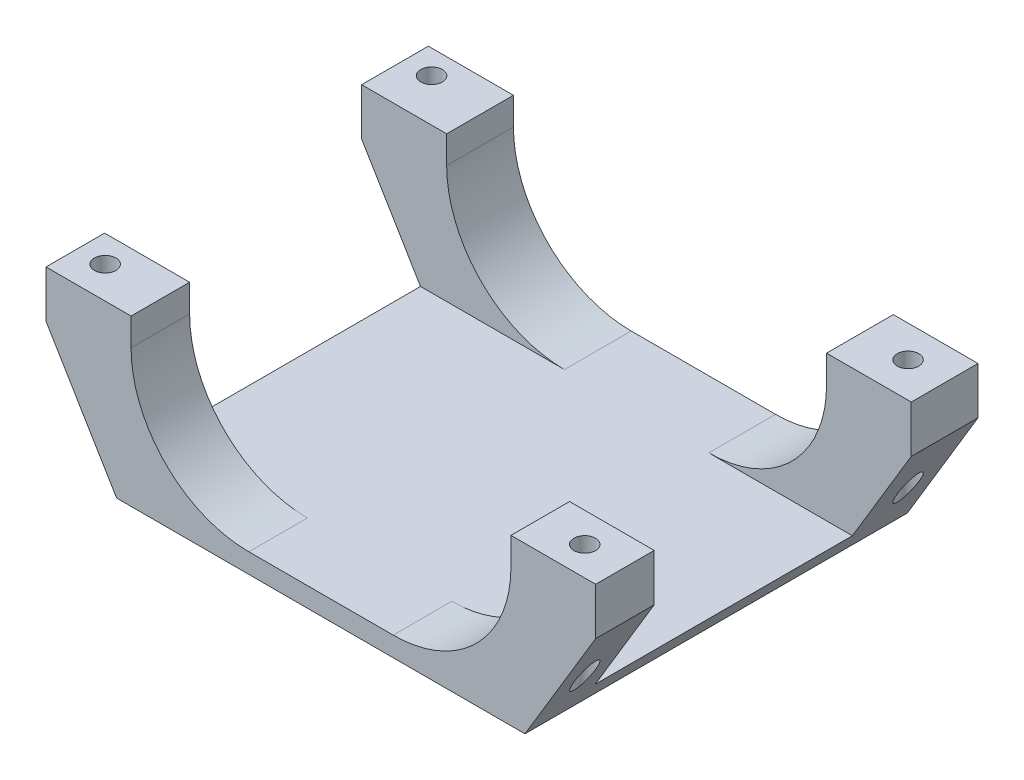
ISO-10303-21;
HEADER;
FILE_DESCRIPTION(('STEP AP214'),'2;1');
FILE_NAME('part.step','',(''),(''),'','','');
FILE_SCHEMA(('AUTOMOTIVE_DESIGN { 1 0 10303 214 1 1 1 1 }'));
ENDSEC;
DATA;
#1=APPLICATION_CONTEXT('core data for automotive mechanical design processes');
#2=APPLICATION_PROTOCOL_DEFINITION('international standard','automotive_design',2000,#1);
#3=PRODUCT_CONTEXT('',#1,'mechanical');
#4=PRODUCT('Part','Part','',(#3));
#5=PRODUCT_RELATED_PRODUCT_CATEGORY('part','',(#4));
#6=PRODUCT_DEFINITION_FORMATION('','',#4);
#7=PRODUCT_DEFINITION_CONTEXT('part definition',#1,'design');
#8=PRODUCT_DEFINITION('design','',#6,#7);
#9=PRODUCT_DEFINITION_SHAPE('','',#8);
#10=(LENGTH_UNIT() NAMED_UNIT(*) SI_UNIT(.MILLI.,.METRE.));
#11=(NAMED_UNIT(*) PLANE_ANGLE_UNIT() SI_UNIT($,.RADIAN.));
#12=(NAMED_UNIT(*) SI_UNIT($,.STERADIAN.) SOLID_ANGLE_UNIT());
#13=UNCERTAINTY_MEASURE_WITH_UNIT(LENGTH_MEASURE(1.E-05),#10,'distance_accuracy_value','');
#14=(GEOMETRIC_REPRESENTATION_CONTEXT(3) GLOBAL_UNCERTAINTY_ASSIGNED_CONTEXT((#13)) GLOBAL_UNIT_ASSIGNED_CONTEXT((#10,
#11,#12)) REPRESENTATION_CONTEXT('',''));
#15=CARTESIAN_POINT('',(0.,0.,0.));
#16=DIRECTION('',(0.,0.,1.));
#17=DIRECTION('',(1.,0.,0.));
#18=AXIS2_PLACEMENT_3D('',#15,#16,#17);
#19=CARTESIAN_POINT('',(88.4243474547859,33.,-97.3933423163109));
#20=DIRECTION('',(0.,0.,1.));
#21=DIRECTION('',(1.,0.,0.));
#22=AXIS2_PLACEMENT_3D('',#19,#20,#21);
#23=CYLINDRICAL_SURFACE('',#22,30.);
#24=DIRECTION('',(0.,0.,1.));
#25=VECTOR('',#24,1.);
#26=CARTESIAN_POINT('',(118.424347454786,33.,-97.3933423163109));
#27=LINE('',#26,#25);
#28=CARTESIAN_POINT('',(118.424347454786,33.,-14.9200311481672));
#29=VERTEX_POINT('',#28);
#30=CARTESIAN_POINT('',(118.424347454786,33.,0.));
#31=VERTEX_POINT('',#30);
#32=EDGE_CURVE('E370',#29,#31,#27,.T.);
#33=ORIENTED_EDGE('',*,*,#32,.F.);
#34=CARTESIAN_POINT('',(88.4243474547859,33.,-14.9200311481672));
#35=DIRECTION('',(0.,0.,-1.));
#36=DIRECTION('',(-1.,0.,0.));
#37=AXIS2_PLACEMENT_3D('',#34,#35,#36);
#38=CIRCLE('',#37,30.);
#39=CARTESIAN_POINT('',(88.4243474547859,3.,-14.9200311481672));
#40=VERTEX_POINT('',#39);
#41=EDGE_CURVE('E40',#29,#40,#38,.T.);
#42=ORIENTED_EDGE('',*,*,#41,.T.);
#43=DIRECTION('',(0.,0.,1.));
#44=VECTOR('',#43,1.);
#45=CARTESIAN_POINT('',(88.4243474547859,3.,0.));
#46=LINE('',#45,#44);
#47=CARTESIAN_POINT('',(88.4243474547859,3.,0.));
#48=VERTEX_POINT('',#47);
#49=EDGE_CURVE('E373',#48,#40,#46,.F.);
#50=ORIENTED_EDGE('',*,*,#49,.F.);
#51=CARTESIAN_POINT('',(88.4243474547859,33.,0.));
#52=DIRECTION('',(0.,0.,1.));
#53=DIRECTION('',(1.,0.,0.));
#54=AXIS2_PLACEMENT_3D('',#51,#52,#53);
#55=CIRCLE('',#54,30.);
#56=EDGE_CURVE('E11',#48,#31,#55,.T.);
#57=ORIENTED_EDGE('',*,*,#56,.T.);
#58=EDGE_LOOP('',(#33,#42,#50,#57));
#59=FACE_BOUND('',#58,.T.);
#60=ADVANCED_FACE('F33',(#59),#23,.F.);
#61=CARTESIAN_POINT('',(51.6644031130144,33.,-97.3933423163109));
#62=DIRECTION('',(0.,0.,-1.));
#63=DIRECTION('',(-1.,0.,0.));
#64=AXIS2_PLACEMENT_3D('',#61,#62,#63);
#65=CYLINDRICAL_SURFACE('',#64,30.);
#66=DIRECTION('',(0.,0.,-1.));
#67=VECTOR('',#66,1.);
#68=CARTESIAN_POINT('',(21.6644031130144,33.,-97.3933423163109));
#69=LINE('',#68,#67);
#70=CARTESIAN_POINT('',(21.6644031130144,33.,0.));
#71=VERTEX_POINT('',#70);
#72=CARTESIAN_POINT('',(21.6644031130144,33.,-14.9200311481672));
#73=VERTEX_POINT('',#72);
#74=EDGE_CURVE('E361',#71,#73,#69,.T.);
#75=ORIENTED_EDGE('',*,*,#74,.F.);
#76=CARTESIAN_POINT('',(51.6644031130144,33.,0.));
#77=DIRECTION('',(0.,0.,1.));
#78=DIRECTION('',(1.,0.,0.));
#79=AXIS2_PLACEMENT_3D('',#76,#77,#78);
#80=CIRCLE('',#79,30.);
#81=CARTESIAN_POINT('',(51.6644031130144,3.,0.));
#82=VERTEX_POINT('',#81);
#83=EDGE_CURVE('E366',#71,#82,#80,.T.);
#84=ORIENTED_EDGE('',*,*,#83,.T.);
#85=DIRECTION('',(0.,0.,-1.));
#86=VECTOR('',#85,1.);
#87=CARTESIAN_POINT('',(51.6644031130144,3.,0.));
#88=LINE('',#87,#86);
#89=CARTESIAN_POINT('',(51.6644031130144,3.,-14.9200311481672));
#90=VERTEX_POINT('',#89);
#91=EDGE_CURVE('E364',#90,#82,#88,.F.);
#92=ORIENTED_EDGE('',*,*,#91,.F.);
#93=CARTESIAN_POINT('',(51.6644031130144,33.,-14.9200311481672));
#94=DIRECTION('',(0.,0.,-1.));
#95=DIRECTION('',(-1.,0.,0.));
#96=AXIS2_PLACEMENT_3D('',#93,#94,#95);
#97=CIRCLE('',#96,30.);
#98=EDGE_CURVE('E211',#90,#73,#97,.T.);
#99=ORIENTED_EDGE('',*,*,#98,.T.);
#100=EDGE_LOOP('',(#75,#84,#92,#99));
#101=FACE_BOUND('',#100,.T.);
#102=ADVANCED_FACE('F382',(#101),#65,.F.);
#103=CARTESIAN_POINT('',(88.4243474547859,33.,-97.3933423163109));
#104=DIRECTION('',(0.,0.,1.));
#105=DIRECTION('',(1.,0.,0.));
#106=AXIS2_PLACEMENT_3D('',#103,#104,#105);
#107=CYLINDRICAL_SURFACE('',#106,30.);
#108=DIRECTION('',(0.,0.,1.));
#109=VECTOR('',#108,1.);
#110=CARTESIAN_POINT('',(118.424347454786,33.,-97.3933423163109));
#111=LINE('',#110,#109);
#112=CARTESIAN_POINT('',(118.424347454786,33.,-97.3933423163109));
#113=VERTEX_POINT('',#112);
#114=CARTESIAN_POINT('',(118.424347454786,33.,-80.3904344454809));
#115=VERTEX_POINT('',#114);
#116=EDGE_CURVE('E351',#113,#115,#111,.T.);
#117=ORIENTED_EDGE('',*,*,#116,.F.);
#118=CARTESIAN_POINT('',(88.4243474547859,33.,-97.3933423163109));
#119=DIRECTION('',(0.,0.,-1.));
#120=DIRECTION('',(-1.,0.,0.));
#121=AXIS2_PLACEMENT_3D('',#118,#119,#120);
#122=CIRCLE('',#121,30.);
#123=CARTESIAN_POINT('',(88.4243474547859,3.,-97.3933423163109));
#124=VERTEX_POINT('',#123);
#125=EDGE_CURVE('E357',#113,#124,#122,.T.);
#126=ORIENTED_EDGE('',*,*,#125,.T.);
#127=DIRECTION('',(0.,0.,1.));
#128=VECTOR('',#127,1.);
#129=CARTESIAN_POINT('',(88.4243474547859,3.,0.));
#130=LINE('',#129,#128);
#131=CARTESIAN_POINT('',(88.4243474547859,3.,-80.3904344454809));
#132=VERTEX_POINT('',#131);
#133=EDGE_CURVE('E354',#132,#124,#130,.F.);
#134=ORIENTED_EDGE('',*,*,#133,.F.);
#135=CARTESIAN_POINT('',(88.4243474547859,33.,-80.3904344454809));
#136=DIRECTION('',(0.,0.,1.));
#137=DIRECTION('',(1.,0.,0.));
#138=AXIS2_PLACEMENT_3D('',#135,#136,#137);
#139=CIRCLE('',#138,30.);
#140=EDGE_CURVE('E359',#132,#115,#139,.T.);
#141=ORIENTED_EDGE('',*,*,#140,.T.);
#142=EDGE_LOOP('',(#117,#126,#134,#141));
#143=FACE_BOUND('',#142,.T.);
#144=ADVANCED_FACE('F453',(#143),#107,.F.);
#145=CARTESIAN_POINT('',(51.6644031130144,33.,-97.3933423163109));
#146=DIRECTION('',(0.,0.,-1.));
#147=DIRECTION('',(-1.,0.,0.));
#148=AXIS2_PLACEMENT_3D('',#145,#146,#147);
#149=CYLINDRICAL_SURFACE('',#148,30.);
#150=DIRECTION('',(0.,0.,-1.));
#151=VECTOR('',#150,1.);
#152=CARTESIAN_POINT('',(21.6644031130144,33.,-97.3933423163109));
#153=LINE('',#152,#151);
#154=CARTESIAN_POINT('',(21.6644031130144,33.,-80.3904344454809));
#155=VERTEX_POINT('',#154);
#156=CARTESIAN_POINT('',(21.6644031130144,33.,-97.3933423163109));
#157=VERTEX_POINT('',#156);
#158=EDGE_CURVE('E327',#155,#157,#153,.T.);
#159=ORIENTED_EDGE('',*,*,#158,.F.);
#160=CARTESIAN_POINT('',(51.6644031130144,33.,-80.3904344454809));
#161=DIRECTION('',(0.,0.,1.));
#162=DIRECTION('',(1.,0.,0.));
#163=AXIS2_PLACEMENT_3D('',#160,#161,#162);
#164=CIRCLE('',#163,30.);
#165=CARTESIAN_POINT('',(51.6644031130144,3.,-80.3904344454809));
#166=VERTEX_POINT('',#165);
#167=EDGE_CURVE('E346',#155,#166,#164,.T.);
#168=ORIENTED_EDGE('',*,*,#167,.T.);
#169=DIRECTION('',(0.,0.,-1.));
#170=VECTOR('',#169,1.);
#171=CARTESIAN_POINT('',(51.6644031130144,3.,0.));
#172=LINE('',#171,#170);
#173=CARTESIAN_POINT('',(51.6644031130144,3.,-97.3933423163109));
#174=VERTEX_POINT('',#173);
#175=EDGE_CURVE('E344',#174,#166,#172,.F.);
#176=ORIENTED_EDGE('',*,*,#175,.F.);
#177=CARTESIAN_POINT('',(51.6644031130144,33.,-97.3933423163109));
#178=DIRECTION('',(0.,0.,-1.));
#179=DIRECTION('',(-1.,0.,0.));
#180=AXIS2_PLACEMENT_3D('',#177,#178,#179);
#181=CIRCLE('',#180,30.);
#182=EDGE_CURVE('E349',#174,#157,#181,.T.);
#183=ORIENTED_EDGE('',*,*,#182,.T.);
#184=EDGE_LOOP('',(#159,#168,#176,#183));
#185=FACE_BOUND('',#184,.T.);
#186=ADVANCED_FACE('F457',(#185),#149,.F.);
#187=CARTESIAN_POINT('',(0.,40.,0.));
#188=DIRECTION('',(0.,-1.,0.));
#189=DIRECTION('',(0.,0.,-1.));
#190=AXIS2_PLACEMENT_3D('',#187,#188,#189);
#191=PLANE('',#190);
#192=CARTESIAN_POINT('',(6.93445288931982,40.,-91.2755933321376));
#193=DIRECTION('',(0.,1.,0.));
#194=DIRECTION('',(0.,0.,1.));
#195=AXIS2_PLACEMENT_3D('',#192,#193,#194);
#196=CIRCLE('',#195,2.75);
#197=CARTESIAN_POINT('',(6.93445288931982,40.,-88.5255933321376));
#198=VERTEX_POINT('',#197);
#199=EDGE_CURVE('E336',#198,#198,#196,.T.);
#200=ORIENTED_EDGE('',*,*,#199,.F.);
#201=EDGE_LOOP('',(#200));
#202=FACE_BOUND('',#201,.T.);
#203=DIRECTION('',(-1.,0.,0.));
#204=VECTOR('',#203,1.);
#205=CARTESIAN_POINT('',(171.664403113014,40.,-80.3904344454809));
#206=LINE('',#205,#204);
#207=CARTESIAN_POINT('',(21.6644031130144,40.,-80.3904344454809));
#208=VERTEX_POINT('',#207);
#209=CARTESIAN_POINT('',(0.,40.,-80.3904344454809));
#210=VERTEX_POINT('',#209);
#211=EDGE_CURVE('E432',#208,#210,#206,.T.);
#212=ORIENTED_EDGE('',*,*,#211,.F.);
#213=DIRECTION('',(0.,0.,1.));
#214=VECTOR('',#213,1.);
#215=CARTESIAN_POINT('',(21.6644031130144,40.,-97.3933423163109));
#216=LINE('',#215,#214);
#217=CARTESIAN_POINT('',(21.6644031130144,40.,-97.3933423163109));
#218=VERTEX_POINT('',#217);
#219=EDGE_CURVE('E270',#218,#208,#216,.T.);
#220=ORIENTED_EDGE('',*,*,#219,.F.);
#221=DIRECTION('',(-1.,0.,0.));
#222=VECTOR('',#221,1.);
#223=CARTESIAN_POINT('',(0.,40.,-97.3933423163109));
#224=LINE('',#223,#222);
#225=CARTESIAN_POINT('',(0.,40.,-97.3933423163109));
#226=VERTEX_POINT('',#225);
#227=EDGE_CURVE('E293',#218,#226,#224,.T.);
#228=ORIENTED_EDGE('',*,*,#227,.T.);
#229=DIRECTION('',(0.,0.,1.));
#230=VECTOR('',#229,1.);
#231=CARTESIAN_POINT('',(0.,40.,0.));
#232=LINE('',#231,#230);
#233=EDGE_CURVE('E282',#226,#210,#232,.T.);
#234=ORIENTED_EDGE('',*,*,#233,.T.);
#235=EDGE_LOOP('',(#212,#220,#228,#234));
#236=FACE_BOUND('',#235,.T.);
#237=ADVANCED_FACE('F463',(#202,#236),#191,.F.);
#238=CARTESIAN_POINT('',(6.93445288931982,40.,-8.12889245211412));
#239=DIRECTION('',(0.,1.,0.));
#240=DIRECTION('',(0.,0.,1.));
#241=AXIS2_PLACEMENT_3D('',#238,#239,#240);
#242=CIRCLE('',#241,2.75);
#243=CARTESIAN_POINT('',(6.93445288931982,40.,-5.37889245211412));
#244=VERTEX_POINT('',#243);
#245=EDGE_CURVE('E331',#244,#244,#242,.T.);
#246=ORIENTED_EDGE('',*,*,#245,.F.);
#247=EDGE_LOOP('',(#246));
#248=FACE_BOUND('',#247,.T.);
#249=DIRECTION('',(-1.,0.,0.));
#250=VECTOR('',#249,1.);
#251=CARTESIAN_POINT('',(171.664403113014,40.,-14.9200311481672));
#252=LINE('',#251,#250);
#253=CARTESIAN_POINT('',(21.6644031130144,40.,-14.9200311481672));
#254=VERTEX_POINT('',#253);
#255=CARTESIAN_POINT('',(0.,40.,-14.9200311481672));
#256=VERTEX_POINT('',#255);
#257=EDGE_CURVE('E393',#254,#256,#252,.T.);
#258=ORIENTED_EDGE('',*,*,#257,.T.);
#259=CARTESIAN_POINT('',(0.,40.,0.));
#260=VERTEX_POINT('',#259);
#261=EDGE_CURVE('E281',#256,#260,#232,.T.);
#262=ORIENTED_EDGE('',*,*,#261,.T.);
#263=DIRECTION('',(1.,0.,0.));
#264=VECTOR('',#263,1.);
#265=CARTESIAN_POINT('',(0.,40.,0.));
#266=LINE('',#265,#264);
#267=CARTESIAN_POINT('',(21.6644031130144,40.,0.));
#268=VERTEX_POINT('',#267);
#269=EDGE_CURVE('E286',#260,#268,#266,.T.);
#270=ORIENTED_EDGE('',*,*,#269,.T.);
#271=EDGE_CURVE('E263',#254,#268,#216,.T.);
#272=ORIENTED_EDGE('',*,*,#271,.F.);
#273=EDGE_LOOP('',(#258,#262,#270,#272));
#274=FACE_BOUND('',#273,.T.);
#275=ADVANCED_FACE('F391',(#248,#274),#191,.F.);
#276=CARTESIAN_POINT('',(0.,-2.,0.));
#277=DIRECTION('',(-1.,0.,0.));
#278=DIRECTION('',(0.,0.,1.));
#279=AXIS2_PLACEMENT_3D('',#276,#277,#278);
#280=PLANE('',#279);
#281=DIRECTION('',(0.,0.,-1.));
#282=VECTOR('',#281,1.);
#283=CARTESIAN_POINT('',(0.,28.,-97.3933423163109));
#284=LINE('',#283,#282);
#285=CARTESIAN_POINT('',(0.,28.,-80.3904344454809));
#286=VERTEX_POINT('',#285);
#287=CARTESIAN_POINT('',(0.,28.,-97.3933423163109));
#288=VERTEX_POINT('',#287);
#289=EDGE_CURVE('E257',#286,#288,#284,.T.);
#290=ORIENTED_EDGE('',*,*,#289,.F.);
#291=DIRECTION('',(0.,1.,0.));
#292=VECTOR('',#291,1.);
#293=CARTESIAN_POINT('',(0.,-2.,-80.3904344454809));
#294=LINE('',#293,#292);
#295=EDGE_CURVE('E234',#286,#210,#294,.T.);
#296=ORIENTED_EDGE('',*,*,#295,.T.);
#297=ORIENTED_EDGE('',*,*,#233,.F.);
#298=DIRECTION('',(0.,1.,0.));
#299=VECTOR('',#298,1.);
#300=CARTESIAN_POINT('',(0.,-2.,-97.3933423163109));
#301=LINE('',#300,#299);
#302=EDGE_CURVE('E303',#288,#226,#301,.T.);
#303=ORIENTED_EDGE('',*,*,#302,.F.);
#304=EDGE_LOOP('',(#290,#296,#297,#303));
#305=FACE_BOUND('',#304,.T.);
#306=ADVANCED_FACE('F465',(#305),#280,.T.);
#307=ORIENTED_EDGE('',*,*,#261,.F.);
#308=DIRECTION('',(0.,-1.,0.));
#309=VECTOR('',#308,1.);
#310=CARTESIAN_POINT('',(0.,-2.,-14.9200311481672));
#311=LINE('',#310,#309);
#312=CARTESIAN_POINT('',(0.,28.,-14.9200311481672));
#313=VERTEX_POINT('',#312);
#314=EDGE_CURVE('E219',#256,#313,#311,.T.);
#315=ORIENTED_EDGE('',*,*,#314,.T.);
#316=CARTESIAN_POINT('',(0.,28.,0.));
#317=VERTEX_POINT('',#316);
#318=EDGE_CURVE('E218',#317,#313,#284,.T.);
#319=ORIENTED_EDGE('',*,*,#318,.F.);
#320=DIRECTION('',(0.,1.,0.));
#321=VECTOR('',#320,1.);
#322=CARTESIAN_POINT('',(0.,-2.,0.));
#323=LINE('',#322,#321);
#324=EDGE_CURVE('E302',#317,#260,#323,.T.);
#325=ORIENTED_EDGE('',*,*,#324,.T.);
#326=EDGE_LOOP('',(#307,#315,#319,#325));
#327=FACE_BOUND('',#326,.T.);
#328=ADVANCED_FACE('F395',(#327),#280,.T.);
#329=CARTESIAN_POINT('',(139.991389113124,-2.,0.));
#330=DIRECTION('',(1.,0.,0.));
#331=DIRECTION('',(0.,0.,-1.));
#332=AXIS2_PLACEMENT_3D('',#329,#330,#331);
#333=PLANE('',#332);
#334=DIRECTION('',(0.,0.,-1.));
#335=VECTOR('',#334,1.);
#336=CARTESIAN_POINT('',(139.991389113124,40.,0.));
#337=LINE('',#336,#335);
#338=CARTESIAN_POINT('',(139.991389113124,40.,-80.3904344454809));
#339=VERTEX_POINT('',#338);
#340=CARTESIAN_POINT('',(139.991389113124,40.,-97.3933423163109));
#341=VERTEX_POINT('',#340);
#342=EDGE_CURVE('E289',#339,#341,#337,.T.);
#343=ORIENTED_EDGE('',*,*,#342,.F.);
#344=DIRECTION('',(0.,-1.,0.));
#345=VECTOR('',#344,1.);
#346=CARTESIAN_POINT('',(139.991389113124,-2.,-80.3904344454809));
#347=LINE('',#346,#345);
#348=CARTESIAN_POINT('',(139.991389113124,28.,-80.3904344454809));
#349=VERTEX_POINT('',#348);
#350=EDGE_CURVE('E229',#339,#349,#347,.T.);
#351=ORIENTED_EDGE('',*,*,#350,.T.);
#352=DIRECTION('',(0.,0.,1.));
#353=VECTOR('',#352,1.);
#354=CARTESIAN_POINT('',(139.991389113124,28.,0.));
#355=LINE('',#354,#353);
#356=CARTESIAN_POINT('',(139.991389113124,28.,-97.3933423163109));
#357=VERTEX_POINT('',#356);
#358=EDGE_CURVE('E260',#357,#349,#355,.T.);
#359=ORIENTED_EDGE('',*,*,#358,.F.);
#360=DIRECTION('',(0.,1.,0.));
#361=VECTOR('',#360,1.);
#362=CARTESIAN_POINT('',(139.991389113124,-2.,-97.3933423163109));
#363=LINE('',#362,#361);
#364=EDGE_CURVE('E306',#357,#341,#363,.T.);
#365=ORIENTED_EDGE('',*,*,#364,.T.);
#366=EDGE_LOOP('',(#343,#351,#359,#365));
#367=FACE_BOUND('',#366,.T.);
#368=ADVANCED_FACE('F471',(#367),#333,.T.);
#369=CARTESIAN_POINT('',(139.991389113124,28.,-14.9200311481672));
#370=VERTEX_POINT('',#369);
#371=CARTESIAN_POINT('',(139.991389113124,28.,0.));
#372=VERTEX_POINT('',#371);
#373=EDGE_CURVE('E264',#370,#372,#355,.T.);
#374=ORIENTED_EDGE('',*,*,#373,.F.);
#375=DIRECTION('',(0.,1.,0.));
#376=VECTOR('',#375,1.);
#377=CARTESIAN_POINT('',(139.991389113124,-2.,-14.9200311481672));
#378=LINE('',#377,#376);
#379=CARTESIAN_POINT('',(139.991389113124,40.,-14.9200311481672));
#380=VERTEX_POINT('',#379);
#381=EDGE_CURVE('E203',#370,#380,#378,.T.);
#382=ORIENTED_EDGE('',*,*,#381,.T.);
#383=CARTESIAN_POINT('',(139.991389113124,40.,0.));
#384=VERTEX_POINT('',#383);
#385=EDGE_CURVE('E290',#384,#380,#337,.T.);
#386=ORIENTED_EDGE('',*,*,#385,.F.);
#387=DIRECTION('',(0.,1.,0.));
#388=VECTOR('',#387,1.);
#389=CARTESIAN_POINT('',(139.991389113124,-2.,0.));
#390=LINE('',#389,#388);
#391=EDGE_CURVE('E309',#372,#384,#390,.T.);
#392=ORIENTED_EDGE('',*,*,#391,.F.);
#393=EDGE_LOOP('',(#374,#382,#386,#392));
#394=FACE_BOUND('',#393,.T.);
#395=ADVANCED_FACE('F419',(#394),#333,.T.);
#396=CARTESIAN_POINT('',(130.288718205918,40.,-89.2741988590018));
#397=DIRECTION('',(0.,1.,0.));
#398=DIRECTION('',(0.,0.,1.));
#399=AXIS2_PLACEMENT_3D('',#396,#397,#398);
#400=CIRCLE('',#399,2.75000000000001);
#401=CARTESIAN_POINT('',(130.288718205918,40.,-86.5241988590018));
#402=VERTEX_POINT('',#401);
#403=EDGE_CURVE('E718',#402,#402,#400,.T.);
#404=ORIENTED_EDGE('',*,*,#403,.F.);
#405=EDGE_LOOP('',(#404));
#406=FACE_BOUND('',#405,.T.);
#407=CARTESIAN_POINT('',(118.424347454786,40.,-80.3904344454809));
#408=VERTEX_POINT('',#407);
#409=EDGE_CURVE('E204',#339,#408,#206,.T.);
#410=ORIENTED_EDGE('',*,*,#409,.F.);
#411=ORIENTED_EDGE('',*,*,#342,.T.);
#412=CARTESIAN_POINT('',(118.424347454786,40.,-97.3933423163109));
#413=VERTEX_POINT('',#412);
#414=EDGE_CURVE('E294',#341,#413,#224,.T.);
#415=ORIENTED_EDGE('',*,*,#414,.T.);
#416=DIRECTION('',(0.,0.,1.));
#417=VECTOR('',#416,1.);
#418=CARTESIAN_POINT('',(118.424347454786,40.,0.));
#419=LINE('',#418,#417);
#420=EDGE_CURVE('E313',#413,#408,#419,.T.);
#421=ORIENTED_EDGE('',*,*,#420,.T.);
#422=EDGE_LOOP('',(#410,#411,#415,#421));
#423=FACE_BOUND('',#422,.T.);
#424=ADVANCED_FACE('F488',(#406,#423),#191,.F.);
#425=CARTESIAN_POINT('',(129.818664092539,40.,-7.39541327956772));
#426=DIRECTION('',(0.,1.,0.));
#427=DIRECTION('',(0.,0.,1.));
#428=AXIS2_PLACEMENT_3D('',#425,#426,#427);
#429=CIRCLE('',#428,2.75000000000001);
#430=CARTESIAN_POINT('',(129.818664092539,40.,-4.64541327956771));
#431=VERTEX_POINT('',#430);
#432=EDGE_CURVE('E721',#431,#431,#429,.T.);
#433=ORIENTED_EDGE('',*,*,#432,.F.);
#434=EDGE_LOOP('',(#433));
#435=FACE_BOUND('',#434,.T.);
#436=CARTESIAN_POINT('',(118.424347454786,40.,-14.9200311481672));
#437=VERTEX_POINT('',#436);
#438=EDGE_CURVE('E421',#380,#437,#252,.T.);
#439=ORIENTED_EDGE('',*,*,#438,.T.);
#440=CARTESIAN_POINT('',(118.424347454786,40.,0.));
#441=VERTEX_POINT('',#440);
#442=EDGE_CURVE('E305',#437,#441,#419,.T.);
#443=ORIENTED_EDGE('',*,*,#442,.T.);
#444=EDGE_CURVE('E285',#441,#384,#266,.T.);
#445=ORIENTED_EDGE('',*,*,#444,.T.);
#446=ORIENTED_EDGE('',*,*,#385,.T.);
#447=EDGE_LOOP('',(#439,#443,#445,#446));
#448=FACE_BOUND('',#447,.T.);
#449=ADVANCED_FACE('F417',(#435,#448),#191,.F.);
#450=CARTESIAN_POINT('',(21.6644031130144,3.,-97.3933423163109));
#451=DIRECTION('',(-1.,0.,0.));
#452=DIRECTION('',(0.,0.,1.));
#453=AXIS2_PLACEMENT_3D('',#450,#451,#452);
#454=PLANE('',#453);
#455=DIRECTION('',(0.,1.,0.));
#456=VECTOR('',#455,1.);
#457=CARTESIAN_POINT('',(21.6644031130144,3.,-80.3904344454809));
#458=LINE('',#457,#456);
#459=EDGE_CURVE('E240',#155,#208,#458,.T.);
#460=ORIENTED_EDGE('',*,*,#459,.F.);
#461=ORIENTED_EDGE('',*,*,#158,.T.);
#462=DIRECTION('',(0.,1.,0.));
#463=VECTOR('',#462,1.);
#464=CARTESIAN_POINT('',(21.6644031130144,3.,-97.3933423163109));
#465=LINE('',#464,#463);
#466=EDGE_CURVE('E273',#157,#218,#465,.T.);
#467=ORIENTED_EDGE('',*,*,#466,.T.);
#468=ORIENTED_EDGE('',*,*,#219,.T.);
#469=EDGE_LOOP('',(#460,#461,#467,#468));
#470=FACE_BOUND('',#469,.T.);
#471=ADVANCED_FACE('F481',(#470),#454,.F.);
#472=DIRECTION('',(0.,-1.,0.));
#473=VECTOR('',#472,1.);
#474=CARTESIAN_POINT('',(21.6644031130144,-2.,0.));
#475=LINE('',#474,#473);
#476=EDGE_CURVE('E278',#268,#71,#475,.T.);
#477=ORIENTED_EDGE('',*,*,#476,.T.);
#478=ORIENTED_EDGE('',*,*,#74,.T.);
#479=DIRECTION('',(0.,-1.,0.));
#480=VECTOR('',#479,1.);
#481=CARTESIAN_POINT('',(21.6644031130144,3.,-14.9200311481672));
#482=LINE('',#481,#480);
#483=EDGE_CURVE('E227',#254,#73,#482,.T.);
#484=ORIENTED_EDGE('',*,*,#483,.F.);
#485=ORIENTED_EDGE('',*,*,#271,.T.);
#486=EDGE_LOOP('',(#477,#478,#484,#485));
#487=FACE_BOUND('',#486,.T.);
#488=ADVANCED_FACE('F385',(#487),#454,.F.);
#489=CARTESIAN_POINT('',(118.424347454786,3.,-97.3933423163109));
#490=DIRECTION('',(1.,0.,0.));
#491=DIRECTION('',(0.,0.,-1.));
#492=AXIS2_PLACEMENT_3D('',#489,#490,#491);
#493=PLANE('',#492);
#494=DIRECTION('',(0.,1.,0.));
#495=VECTOR('',#494,1.);
#496=CARTESIAN_POINT('',(118.424347454786,3.,-97.3933423163109));
#497=LINE('',#496,#495);
#498=EDGE_CURVE('E269',#113,#413,#497,.T.);
#499=ORIENTED_EDGE('',*,*,#498,.F.);
#500=ORIENTED_EDGE('',*,*,#116,.T.);
#501=DIRECTION('',(0.,-1.,0.));
#502=VECTOR('',#501,1.);
#503=CARTESIAN_POINT('',(118.424347454786,3.,-80.3904344454809));
#504=LINE('',#503,#502);
#505=EDGE_CURVE('E237',#408,#115,#504,.T.);
#506=ORIENTED_EDGE('',*,*,#505,.F.);
#507=ORIENTED_EDGE('',*,*,#420,.F.);
#508=EDGE_LOOP('',(#499,#500,#506,#507));
#509=FACE_BOUND('',#508,.T.);
#510=ADVANCED_FACE('F438',(#509),#493,.F.);
#511=DIRECTION('',(0.,1.,0.));
#512=VECTOR('',#511,1.);
#513=CARTESIAN_POINT('',(118.424347454786,3.,-14.9200311481672));
#514=LINE('',#513,#512);
#515=EDGE_CURVE('E221',#29,#437,#514,.T.);
#516=ORIENTED_EDGE('',*,*,#515,.F.);
#517=ORIENTED_EDGE('',*,*,#32,.T.);
#518=DIRECTION('',(0.,1.,0.));
#519=VECTOR('',#518,1.);
#520=CARTESIAN_POINT('',(118.424347454786,-2.,0.));
#521=LINE('',#520,#519);
#522=EDGE_CURVE('E275',#31,#441,#521,.T.);
#523=ORIENTED_EDGE('',*,*,#522,.T.);
#524=ORIENTED_EDGE('',*,*,#442,.F.);
#525=EDGE_LOOP('',(#516,#517,#523,#524));
#526=FACE_BOUND('',#525,.T.);
#527=ADVANCED_FACE('F436',(#526),#493,.F.);
#528=CARTESIAN_POINT('',(18.,-2.,-132.379053685383));
#529=DIRECTION('',(-0.857492925712544,-0.514495755427526,0.));
#530=DIRECTION('',(0.514495755427527,-0.857492925712544,0.));
#531=AXIS2_PLACEMENT_3D('',#528,#529,#530);
#532=PLANE('',#531);
#533=CARTESIAN_POINT('',(6.93445288931982,16.4425785178003,-91.2755933321376));
#534=DIRECTION('',(-0.857492925712544,-0.514495755427526,0.));
#535=DIRECTION('',(-0.514495755427527,0.857492925712544,0.));
#536=AXIS2_PLACEMENT_3D('',#533,#534,#535);
#537=ELLIPSE('',#536,5.34503923694152,2.75);
#538=CARTESIAN_POINT('',(4.18445288931982,21.0259118511336,-91.2755933321376));
#539=VERTEX_POINT('',#538);
#540=EDGE_CURVE('E339',#539,#539,#537,.T.);
#541=ORIENTED_EDGE('',*,*,#540,.F.);
#542=EDGE_LOOP('',(#541));
#543=FACE_BOUND('',#542,.T.);
#544=CARTESIAN_POINT('',(6.93445288931982,16.4425785178003,-8.12889245211412));
#545=DIRECTION('',(-0.857492925712544,-0.514495755427526,0.));
#546=DIRECTION('',(-0.514495755427527,0.857492925712544,0.));
#547=AXIS2_PLACEMENT_3D('',#544,#545,#546);
#548=ELLIPSE('',#547,5.34503923694152,2.75);
#549=CARTESIAN_POINT('',(4.18445288931982,21.0259118511336,-8.12889245211412));
#550=VERTEX_POINT('',#549);
#551=EDGE_CURVE('E328',#550,#550,#548,.T.);
#552=ORIENTED_EDGE('',*,*,#551,.F.);
#553=EDGE_LOOP('',(#552));
#554=FACE_BOUND('',#553,.T.);
#555=DIRECTION('',(0.,0.,-1.));
#556=VECTOR('',#555,1.);
#557=CARTESIAN_POINT('',(15.,3.,-132.379053685383));
#558=LINE('',#557,#556);
#559=CARTESIAN_POINT('',(15.,3.,-14.9200311481672));
#560=VERTEX_POINT('',#559);
#561=CARTESIAN_POINT('',(15.,3.,-80.3904344454809));
#562=VERTEX_POINT('',#561);
#563=EDGE_CURVE('E190',#560,#562,#558,.T.);
#564=ORIENTED_EDGE('',*,*,#563,.T.);
#565=DIRECTION('',(-0.514495755427527,0.857492925712544,0.));
#566=VECTOR('',#565,1.);
#567=CARTESIAN_POINT('',(18.,-2.,-80.3904344454809));
#568=LINE('',#567,#566);
#569=EDGE_CURVE('E232',#562,#286,#568,.T.);
#570=ORIENTED_EDGE('',*,*,#569,.T.);
#571=ORIENTED_EDGE('',*,*,#289,.T.);
#572=DIRECTION('',(0.514495755427527,-0.857492925712544,0.));
#573=VECTOR('',#572,1.);
#574=CARTESIAN_POINT('',(18.,-2.,-97.3933423163109));
#575=LINE('',#574,#573);
#576=CARTESIAN_POINT('',(18.,-2.,-97.3933423163109));
#577=VERTEX_POINT('',#576);
#578=EDGE_CURVE('E251',#288,#577,#575,.T.);
#579=ORIENTED_EDGE('',*,*,#578,.T.);
#580=DIRECTION('',(0.,0.,1.));
#581=VECTOR('',#580,1.);
#582=CARTESIAN_POINT('',(18.,-2.,-97.3933423163109));
#583=LINE('',#582,#581);
#584=CARTESIAN_POINT('',(18.,-2.,0.));
#585=VERTEX_POINT('',#584);
#586=EDGE_CURVE('E254',#577,#585,#583,.T.);
#587=ORIENTED_EDGE('',*,*,#586,.T.);
#588=DIRECTION('',(0.514495755427526,-0.857492925712544,0.));
#589=VECTOR('',#588,1.);
#590=CARTESIAN_POINT('',(18.,-2.,0.));
#591=LINE('',#590,#589);
#592=EDGE_CURVE('E248',#317,#585,#591,.T.);
#593=ORIENTED_EDGE('',*,*,#592,.F.);
#594=ORIENTED_EDGE('',*,*,#318,.T.);
#595=DIRECTION('',(0.514495755427527,-0.857492925712544,0.));
#596=VECTOR('',#595,1.);
#597=CARTESIAN_POINT('',(18.,-2.00000000000001,-14.9200311481672));
#598=LINE('',#597,#596);
#599=EDGE_CURVE('E209',#313,#560,#598,.T.);
#600=ORIENTED_EDGE('',*,*,#599,.T.);
#601=EDGE_LOOP('',(#564,#570,#571,#579,#587,#593,#594,#600));
#602=FACE_BOUND('',#601,.T.);
#603=ADVANCED_FACE('F216',(#543,#554,#602),#532,.T.);
#604=CARTESIAN_POINT('',(121.991389113124,-2.,-132.379053685383));
#605=DIRECTION('',(0.857492925712544,-0.514495755427527,0.));
#606=DIRECTION('',(0.514495755427527,0.857492925712544,0.));
#607=AXIS2_PLACEMENT_3D('',#604,#605,#606);
#608=PLANE('',#607);
#609=CARTESIAN_POINT('',(130.288718205918,11.8288818213232,-89.2741988590018));
#610=DIRECTION('',(0.857492925712544,-0.514495755427527,0.));
#611=DIRECTION('',(0.514495755427527,0.857492925712544,0.));
#612=AXIS2_PLACEMENT_3D('',#609,#610,#611);
#613=ELLIPSE('',#612,5.34503923694154,2.75000000000001);
#614=CARTESIAN_POINT('',(133.038718205918,16.4122151546565,-89.2741988590018));
#615=VERTEX_POINT('',#614);
#616=EDGE_CURVE('E335',#615,#615,#613,.T.);
#617=ORIENTED_EDGE('',*,*,#616,.F.);
#618=EDGE_LOOP('',(#617));
#619=FACE_BOUND('',#618,.T.);
#620=CARTESIAN_POINT('',(129.818664092539,11.0454582990254,-7.39541327956772));
#621=DIRECTION('',(0.857492925712544,-0.514495755427527,0.));
#622=DIRECTION('',(0.514495755427527,0.857492925712544,0.));
#623=AXIS2_PLACEMENT_3D('',#620,#621,#622);
#624=ELLIPSE('',#623,5.34503923694154,2.75000000000001);
#625=CARTESIAN_POINT('',(132.568664092539,15.6287916323588,-7.39541327956772));
#626=VERTEX_POINT('',#625);
#627=EDGE_CURVE('E332',#626,#626,#624,.T.);
#628=ORIENTED_EDGE('',*,*,#627,.F.);
#629=EDGE_LOOP('',(#628));
#630=FACE_BOUND('',#629,.T.);
#631=ORIENTED_EDGE('',*,*,#358,.T.);
#632=DIRECTION('',(-0.514495755427527,-0.857492925712544,0.));
#633=VECTOR('',#632,1.);
#634=CARTESIAN_POINT('',(121.991389113124,-2.,-80.3904344454809));
#635=LINE('',#634,#633);
#636=CARTESIAN_POINT('',(124.991389113124,3.,-80.3904344454809));
#637=VERTEX_POINT('',#636);
#638=EDGE_CURVE('E324',#349,#637,#635,.T.);
#639=ORIENTED_EDGE('',*,*,#638,.T.);
#640=DIRECTION('',(0.,0.,1.));
#641=VECTOR('',#640,1.);
#642=CARTESIAN_POINT('',(124.991389113124,3.,-132.379053685383));
#643=LINE('',#642,#641);
#644=CARTESIAN_POINT('',(124.991389113124,3.,-14.9200311481672));
#645=VERTEX_POINT('',#644);
#646=EDGE_CURVE('E318',#637,#645,#643,.T.);
#647=ORIENTED_EDGE('',*,*,#646,.T.);
#648=DIRECTION('',(0.514495755427527,0.857492925712544,0.));
#649=VECTOR('',#648,1.);
#650=CARTESIAN_POINT('',(121.991389113124,-1.99999999999999,-14.9200311481672));
#651=LINE('',#650,#649);
#652=EDGE_CURVE('E321',#645,#370,#651,.T.);
#653=ORIENTED_EDGE('',*,*,#652,.T.);
#654=ORIENTED_EDGE('',*,*,#373,.T.);
#655=DIRECTION('',(0.514495755427527,0.857492925712544,0.));
#656=VECTOR('',#655,1.);
#657=CARTESIAN_POINT('',(121.991389113124,-2.,0.));
#658=LINE('',#657,#656);
#659=CARTESIAN_POINT('',(121.991389113124,-2.,0.));
#660=VERTEX_POINT('',#659);
#661=EDGE_CURVE('E242',#660,#372,#658,.T.);
#662=ORIENTED_EDGE('',*,*,#661,.F.);
#663=DIRECTION('',(0.,0.,-1.));
#664=VECTOR('',#663,1.);
#665=CARTESIAN_POINT('',(121.991389113124,-2.,0.));
#666=LINE('',#665,#664);
#667=CARTESIAN_POINT('',(121.991389113124,-2.,-97.3933423163109));
#668=VERTEX_POINT('',#667);
#669=EDGE_CURVE('E256',#660,#668,#666,.T.);
#670=ORIENTED_EDGE('',*,*,#669,.T.);
#671=DIRECTION('',(0.514495755427527,0.857492925712544,0.));
#672=VECTOR('',#671,1.);
#673=CARTESIAN_POINT('',(121.991389113124,-2.,-97.3933423163109));
#674=LINE('',#673,#672);
#675=EDGE_CURVE('E245',#668,#357,#674,.T.);
#676=ORIENTED_EDGE('',*,*,#675,.T.);
#677=EDGE_LOOP('',(#631,#639,#647,#653,#654,#662,#670,#676));
#678=FACE_BOUND('',#677,.T.);
#679=ADVANCED_FACE('F407',(#619,#630,#678),#608,.T.);
#680=CARTESIAN_POINT('',(0.,-2.,-97.3933423163109));
#681=DIRECTION('',(0.,0.,-1.));
#682=DIRECTION('',(-1.,0.,0.));
#683=AXIS2_PLACEMENT_3D('',#680,#681,#682);
#684=PLANE('',#683);
#685=ORIENTED_EDGE('',*,*,#125,.F.);
#686=ORIENTED_EDGE('',*,*,#498,.T.);
#687=ORIENTED_EDGE('',*,*,#414,.F.);
#688=ORIENTED_EDGE('',*,*,#364,.F.);
#689=ORIENTED_EDGE('',*,*,#675,.F.);
#690=DIRECTION('',(-1.,0.,0.));
#691=VECTOR('',#690,1.);
#692=CARTESIAN_POINT('',(0.,-2.,-97.3933423163109));
#693=LINE('',#692,#691);
#694=EDGE_CURVE('E299',#668,#577,#693,.T.);
#695=ORIENTED_EDGE('',*,*,#694,.T.);
#696=ORIENTED_EDGE('',*,*,#578,.F.);
#697=ORIENTED_EDGE('',*,*,#302,.T.);
#698=ORIENTED_EDGE('',*,*,#227,.F.);
#699=ORIENTED_EDGE('',*,*,#466,.F.);
#700=ORIENTED_EDGE('',*,*,#182,.F.);
#701=DIRECTION('',(-1.,0.,0.));
#702=VECTOR('',#701,1.);
#703=CARTESIAN_POINT('',(21.6644031130144,3.,-97.3933423163109));
#704=LINE('',#703,#702);
#705=EDGE_CURVE('E267',#124,#174,#704,.T.);
#706=ORIENTED_EDGE('',*,*,#705,.F.);
#707=EDGE_LOOP('',(#685,#686,#687,#688,#689,#695,#696,#697,#698,#699,#700,#706));
#708=FACE_BOUND('',#707,.T.);
#709=ADVANCED_FACE('F402',(#708),#684,.T.);
#710=CARTESIAN_POINT('',(0.,-2.,0.));
#711=DIRECTION('',(0.,0.,1.));
#712=DIRECTION('',(1.,0.,0.));
#713=AXIS2_PLACEMENT_3D('',#710,#711,#712);
#714=PLANE('',#713);
#715=ORIENTED_EDGE('',*,*,#56,.F.);
#716=DIRECTION('',(-1.,0.,0.));
#717=VECTOR('',#716,1.);
#718=CARTESIAN_POINT('',(0.,3.,0.));
#719=LINE('',#718,#717);
#720=EDGE_CURVE('E316',#48,#82,#719,.T.);
#721=ORIENTED_EDGE('',*,*,#720,.T.);
#722=ORIENTED_EDGE('',*,*,#83,.F.);
#723=ORIENTED_EDGE('',*,*,#476,.F.);
#724=ORIENTED_EDGE('',*,*,#269,.F.);
#725=ORIENTED_EDGE('',*,*,#324,.F.);
#726=ORIENTED_EDGE('',*,*,#592,.T.);
#727=DIRECTION('',(1.,0.,0.));
#728=VECTOR('',#727,1.);
#729=CARTESIAN_POINT('',(0.,-2.,0.));
#730=LINE('',#729,#728);
#731=EDGE_CURVE('E297',#585,#660,#730,.T.);
#732=ORIENTED_EDGE('',*,*,#731,.T.);
#733=ORIENTED_EDGE('',*,*,#661,.T.);
#734=ORIENTED_EDGE('',*,*,#391,.T.);
#735=ORIENTED_EDGE('',*,*,#444,.F.);
#736=ORIENTED_EDGE('',*,*,#522,.F.);
#737=EDGE_LOOP('',(#715,#721,#722,#723,#724,#725,#726,#732,#733,#734,#735,#736));
#738=FACE_BOUND('',#737,.T.);
#739=ADVANCED_FACE('F378',(#738),#714,.T.);
#740=CARTESIAN_POINT('',(0.,-2.,0.));
#741=DIRECTION('',(0.,-1.,0.));
#742=DIRECTION('',(0.,0.,-1.));
#743=AXIS2_PLACEMENT_3D('',#740,#741,#742);
#744=PLANE('',#743);
#745=ORIENTED_EDGE('',*,*,#586,.F.);
#746=ORIENTED_EDGE('',*,*,#694,.F.);
#747=ORIENTED_EDGE('',*,*,#669,.F.);
#748=ORIENTED_EDGE('',*,*,#731,.F.);
#749=EDGE_LOOP('',(#745,#746,#747,#748));
#750=FACE_BOUND('',#749,.T.);
#751=ADVANCED_FACE('F398',(#750),#744,.T.);
#752=CARTESIAN_POINT('',(0.,3.,0.));
#753=DIRECTION('',(0.,1.,0.));
#754=DIRECTION('',(0.,0.,1.));
#755=AXIS2_PLACEMENT_3D('',#752,#753,#754);
#756=PLANE('',#755);
#757=ORIENTED_EDGE('',*,*,#720,.F.);
#758=ORIENTED_EDGE('',*,*,#49,.T.);
#759=DIRECTION('',(-1.,0.,0.));
#760=VECTOR('',#759,1.);
#761=CARTESIAN_POINT('',(171.664403113014,3.,-14.9200311481672));
#762=LINE('',#761,#760);
#763=EDGE_CURVE('E47',#645,#40,#762,.T.);
#764=ORIENTED_EDGE('',*,*,#763,.F.);
#765=ORIENTED_EDGE('',*,*,#646,.F.);
#766=DIRECTION('',(-1.,0.,0.));
#767=VECTOR('',#766,1.);
#768=CARTESIAN_POINT('',(171.664403113014,3.,-80.3904344454809));
#769=LINE('',#768,#767);
#770=EDGE_CURVE('E213',#637,#132,#769,.T.);
#771=ORIENTED_EDGE('',*,*,#770,.T.);
#772=ORIENTED_EDGE('',*,*,#133,.T.);
#773=ORIENTED_EDGE('',*,*,#705,.T.);
#774=ORIENTED_EDGE('',*,*,#175,.T.);
#775=EDGE_CURVE('E198',#166,#562,#769,.T.);
#776=ORIENTED_EDGE('',*,*,#775,.T.);
#777=ORIENTED_EDGE('',*,*,#563,.F.);
#778=EDGE_CURVE('E195',#90,#560,#762,.T.);
#779=ORIENTED_EDGE('',*,*,#778,.F.);
#780=ORIENTED_EDGE('',*,*,#91,.T.);
#781=EDGE_LOOP('',(#757,#758,#764,#765,#771,#772,#773,#774,#776,#777,#779,#780));
#782=FACE_BOUND('',#781,.T.);
#783=ADVANCED_FACE('F193',(#782),#756,.T.);
#784=CARTESIAN_POINT('',(171.664403113014,3.,-14.9200311481672));
#785=DIRECTION('',(0.,0.,-1.));
#786=DIRECTION('',(-1.,0.,0.));
#787=AXIS2_PLACEMENT_3D('',#784,#785,#786);
#788=PLANE('',#787);
#789=ORIENTED_EDGE('',*,*,#763,.T.);
#790=ORIENTED_EDGE('',*,*,#41,.F.);
#791=ORIENTED_EDGE('',*,*,#515,.T.);
#792=ORIENTED_EDGE('',*,*,#438,.F.);
#793=ORIENTED_EDGE('',*,*,#381,.F.);
#794=ORIENTED_EDGE('',*,*,#652,.F.);
#795=EDGE_LOOP('',(#789,#790,#791,#792,#793,#794));
#796=FACE_BOUND('',#795,.T.);
#797=ADVANCED_FACE('F420',(#796),#788,.T.);
#798=CARTESIAN_POINT('',(171.664403113014,3.,-80.3904344454809));
#799=DIRECTION('',(0.,0.,1.));
#800=DIRECTION('',(1.,0.,0.));
#801=AXIS2_PLACEMENT_3D('',#798,#799,#800);
#802=PLANE('',#801);
#803=ORIENTED_EDGE('',*,*,#505,.T.);
#804=ORIENTED_EDGE('',*,*,#140,.F.);
#805=ORIENTED_EDGE('',*,*,#770,.F.);
#806=ORIENTED_EDGE('',*,*,#638,.F.);
#807=ORIENTED_EDGE('',*,*,#350,.F.);
#808=ORIENTED_EDGE('',*,*,#409,.T.);
#809=EDGE_LOOP('',(#803,#804,#805,#806,#807,#808));
#810=FACE_BOUND('',#809,.T.);
#811=ADVANCED_FACE('F425',(#810),#802,.T.);
#812=ORIENTED_EDGE('',*,*,#775,.F.);
#813=ORIENTED_EDGE('',*,*,#167,.F.);
#814=ORIENTED_EDGE('',*,*,#459,.T.);
#815=ORIENTED_EDGE('',*,*,#211,.T.);
#816=ORIENTED_EDGE('',*,*,#295,.F.);
#817=ORIENTED_EDGE('',*,*,#569,.F.);
#818=EDGE_LOOP('',(#812,#813,#814,#815,#816,#817));
#819=FACE_BOUND('',#818,.T.);
#820=ADVANCED_FACE('F494',(#819),#802,.T.);
#821=ORIENTED_EDGE('',*,*,#483,.T.);
#822=ORIENTED_EDGE('',*,*,#98,.F.);
#823=ORIENTED_EDGE('',*,*,#778,.T.);
#824=ORIENTED_EDGE('',*,*,#599,.F.);
#825=ORIENTED_EDGE('',*,*,#314,.F.);
#826=ORIENTED_EDGE('',*,*,#257,.F.);
#827=EDGE_LOOP('',(#821,#822,#823,#824,#825,#826));
#828=FACE_BOUND('',#827,.T.);
#829=ADVANCED_FACE('F208',(#828),#788,.T.);
#830=CARTESIAN_POINT('',(6.93445288931982,-20.,-8.12889245211412));
#831=DIRECTION('',(0.,1.,0.));
#832=DIRECTION('',(0.,0.,1.));
#833=AXIS2_PLACEMENT_3D('',#830,#831,#832);
#834=CYLINDRICAL_SURFACE('',#833,2.75);
#835=ORIENTED_EDGE('',*,*,#551,.T.);
#836=EDGE_LOOP('',(#835));
#837=FACE_BOUND('',#836,.T.);
#838=ORIENTED_EDGE('',*,*,#245,.T.);
#839=EDGE_LOOP('',(#838));
#840=FACE_BOUND('',#839,.T.);
#841=ADVANCED_FACE('F524',(#837,#840),#834,.F.);
#842=CARTESIAN_POINT('',(129.818664092539,-20.,-7.39541327956772));
#843=DIRECTION('',(0.,1.,0.));
#844=DIRECTION('',(0.,0.,1.));
#845=AXIS2_PLACEMENT_3D('',#842,#843,#844);
#846=CYLINDRICAL_SURFACE('',#845,2.75000000000001);
#847=ORIENTED_EDGE('',*,*,#627,.T.);
#848=EDGE_LOOP('',(#847));
#849=FACE_BOUND('',#848,.T.);
#850=ORIENTED_EDGE('',*,*,#432,.T.);
#851=EDGE_LOOP('',(#850));
#852=FACE_BOUND('',#851,.T.);
#853=ADVANCED_FACE('F526',(#849,#852),#846,.F.);
#854=CARTESIAN_POINT('',(130.288718205918,-20.,-89.2741988590018));
#855=DIRECTION('',(0.,1.,0.));
#856=DIRECTION('',(0.,0.,1.));
#857=AXIS2_PLACEMENT_3D('',#854,#855,#856);
#858=CYLINDRICAL_SURFACE('',#857,2.75000000000001);
#859=ORIENTED_EDGE('',*,*,#616,.T.);
#860=EDGE_LOOP('',(#859));
#861=FACE_BOUND('',#860,.T.);
#862=ORIENTED_EDGE('',*,*,#403,.T.);
#863=EDGE_LOOP('',(#862));
#864=FACE_BOUND('',#863,.T.);
#865=ADVANCED_FACE('F533',(#861,#864),#858,.F.);
#866=CARTESIAN_POINT('',(6.93445288931982,-20.,-91.2755933321376));
#867=DIRECTION('',(0.,1.,0.));
#868=DIRECTION('',(0.,0.,1.));
#869=AXIS2_PLACEMENT_3D('',#866,#867,#868);
#870=CYLINDRICAL_SURFACE('',#869,2.75);
#871=ORIENTED_EDGE('',*,*,#540,.T.);
#872=EDGE_LOOP('',(#871));
#873=FACE_BOUND('',#872,.T.);
#874=ORIENTED_EDGE('',*,*,#199,.T.);
#875=EDGE_LOOP('',(#874));
#876=FACE_BOUND('',#875,.T.);
#877=ADVANCED_FACE('F689',(#873,#876),#870,.F.);
#878=CLOSED_SHELL('',(#60,#102,#144,#186,#237,#275,#306,#328,#368,#395,#424,#449,#471,#488,#510,
#527,#603,#679,#709,#739,#751,#783,#797,#811,#820,#829,#841,#853,#865,#877));
#879=MANIFOLD_SOLID_BREP('B2',#878);
#880=ADVANCED_BREP_SHAPE_REPRESENTATION('',(#18,#879),#14);
#881=SHAPE_DEFINITION_REPRESENTATION(#9,#880);
ENDSEC;
END-ISO-10303-21;
